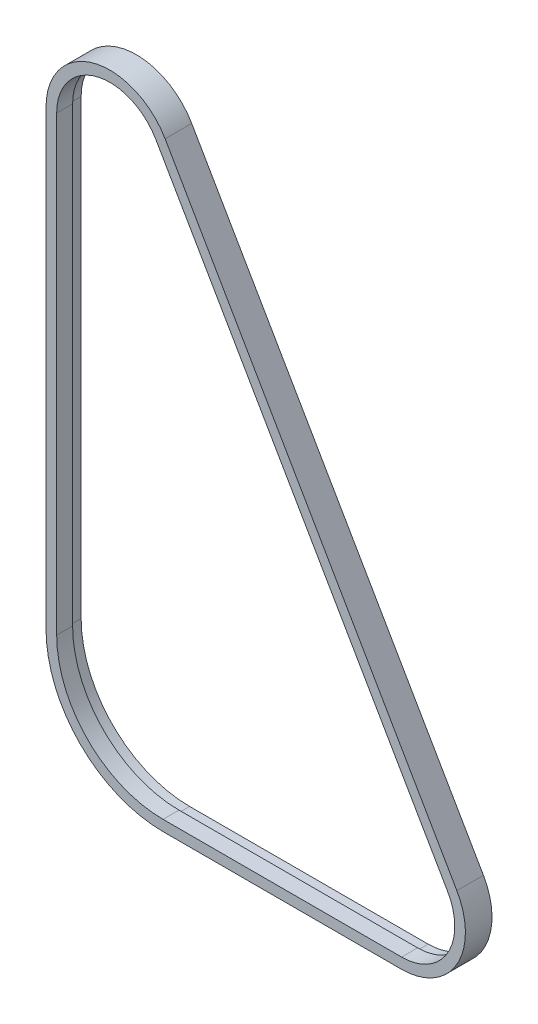
ISO-10303-21;
HEADER;
FILE_DESCRIPTION(('STEP AP214'),'2;1');
FILE_NAME('part.step','',(''),(''),'','','');
FILE_SCHEMA(('AUTOMOTIVE_DESIGN { 1 0 10303 214 1 1 1 1 }'));
ENDSEC;
DATA;
#1=APPLICATION_CONTEXT('core data for automotive mechanical design processes');
#2=APPLICATION_PROTOCOL_DEFINITION('international standard','automotive_design',2000,#1);
#3=PRODUCT_CONTEXT('',#1,'mechanical');
#4=PRODUCT('Part','Part','',(#3));
#5=PRODUCT_RELATED_PRODUCT_CATEGORY('part','',(#4));
#6=PRODUCT_DEFINITION_FORMATION('','',#4);
#7=PRODUCT_DEFINITION_CONTEXT('part definition',#1,'design');
#8=PRODUCT_DEFINITION('design','',#6,#7);
#9=PRODUCT_DEFINITION_SHAPE('','',#8);
#10=(LENGTH_UNIT() NAMED_UNIT(*) SI_UNIT(.MILLI.,.METRE.));
#11=(NAMED_UNIT(*) PLANE_ANGLE_UNIT() SI_UNIT($,.RADIAN.));
#12=(NAMED_UNIT(*) SI_UNIT($,.STERADIAN.) SOLID_ANGLE_UNIT());
#13=UNCERTAINTY_MEASURE_WITH_UNIT(LENGTH_MEASURE(1.E-05),#10,'distance_accuracy_value','');
#14=(GEOMETRIC_REPRESENTATION_CONTEXT(3) GLOBAL_UNCERTAINTY_ASSIGNED_CONTEXT((#13)) GLOBAL_UNIT_ASSIGNED_CONTEXT((#10,
#11,#12)) REPRESENTATION_CONTEXT('',''));
#15=CARTESIAN_POINT('',(0.,0.,0.));
#16=DIRECTION('',(0.,0.,1.));
#17=DIRECTION('',(1.,0.,0.));
#18=AXIS2_PLACEMENT_3D('',#15,#16,#17);
#19=CARTESIAN_POINT('',(-50.,525.,0.));
#20=DIRECTION('',(0.,0.,-1.));
#21=DIRECTION('',(-1.,0.,0.));
#22=AXIS2_PLACEMENT_3D('',#19,#20,#21);
#23=PLANE('',#22);
#24=CARTESIAN_POINT('',(-50.,525.,0.));
#25=DIRECTION('',(0.,0.,1.));
#26=DIRECTION('',(-1.,0.,0.));
#27=AXIS2_PLACEMENT_3D('',#24,#25,#26);
#28=CIRCLE('',#27,60.);
#29=CARTESIAN_POINT('',(1.96152422706617,555.,0.));
#30=VERTEX_POINT('',#29);
#31=CARTESIAN_POINT('',(-110.,525.,0.));
#32=VERTEX_POINT('',#31);
#33=EDGE_CURVE('E229',#30,#32,#28,.T.);
#34=ORIENTED_EDGE('',*,*,#33,.F.);
#35=DIRECTION('',(-0.500000000000004,0.866025403784436,0.));
#36=VECTOR('',#35,1.);
#37=CARTESIAN_POINT('',(1.96152422706617,555.,0.));
#38=LINE('',#37,#36);
#39=CARTESIAN_POINT('',(276.202902092142,80.0000000000001,0.));
#40=VERTEX_POINT('',#39);
#41=EDGE_CURVE('E234',#40,#30,#38,.T.);
#42=ORIENTED_EDGE('',*,*,#41,.F.);
#43=CARTESIAN_POINT('',(224.241377865075,49.9999999999999,0.));
#44=DIRECTION('',(0.,0.,1.));
#45=DIRECTION('',(-1.,0.,0.));
#46=AXIS2_PLACEMENT_3D('',#43,#44,#45);
#47=CIRCLE('',#46,60.);
#48=CARTESIAN_POINT('',(224.241377865075,-10.0000000000001,0.));
#49=VERTEX_POINT('',#48);
#50=EDGE_CURVE('E253',#49,#40,#47,.T.);
#51=ORIENTED_EDGE('',*,*,#50,.F.);
#52=DIRECTION('',(1.,0.,0.));
#53=VECTOR('',#52,1.);
#54=CARTESIAN_POINT('',(224.241377865075,-10.0000000000001,0.));
#55=LINE('',#54,#53);
#56=CARTESIAN_POINT('',(0.,-10.,0.));
#57=VERTEX_POINT('',#56);
#58=EDGE_CURVE('E251',#57,#49,#55,.T.);
#59=ORIENTED_EDGE('',*,*,#58,.F.);
#60=CARTESIAN_POINT('',(0.,100.,0.));
#61=DIRECTION('',(0.,0.,1.));
#62=DIRECTION('',(1.,0.,0.));
#63=AXIS2_PLACEMENT_3D('',#60,#61,#62);
#64=CIRCLE('',#63,110.);
#65=CARTESIAN_POINT('',(-110.,100.,0.));
#66=VERTEX_POINT('',#65);
#67=EDGE_CURVE('E249',#66,#57,#64,.T.);
#68=ORIENTED_EDGE('',*,*,#67,.F.);
#69=DIRECTION('',(0.,-1.,0.));
#70=VECTOR('',#69,1.);
#71=CARTESIAN_POINT('',(-110.,100.,0.));
#72=LINE('',#71,#70);
#73=EDGE_CURVE('E247',#32,#66,#72,.T.);
#74=ORIENTED_EDGE('',*,*,#73,.F.);
#75=EDGE_LOOP('',(#34,#42,#51,#59,#68,#74));
#76=FACE_BOUND('',#75,.T.);
#77=DIRECTION('',(-0.500000000000004,0.866025403784436,0.));
#78=VECTOR('',#77,1.);
#79=CARTESIAN_POINT('',(269.274698861866,76.0000000000001,0.));
#80=LINE('',#79,#78);
#81=CARTESIAN_POINT('',(269.274698861866,76.0000000000001,0.));
#82=VERTEX_POINT('',#81);
#83=CARTESIAN_POINT('',(-4.96667900320927,551.,0.));
#84=VERTEX_POINT('',#83);
#85=EDGE_CURVE('E178',#82,#84,#80,.T.);
#86=ORIENTED_EDGE('',*,*,#85,.T.);
#87=CARTESIAN_POINT('',(-50.,525.,0.));
#88=DIRECTION('',(0.,0.,1.));
#89=DIRECTION('',(1.,0.,0.));
#90=AXIS2_PLACEMENT_3D('',#87,#88,#89);
#91=CIRCLE('',#90,52.);
#92=CARTESIAN_POINT('',(-102.,525.,0.));
#93=VERTEX_POINT('',#92);
#94=EDGE_CURVE('E53',#84,#93,#91,.T.);
#95=ORIENTED_EDGE('',*,*,#94,.T.);
#96=DIRECTION('',(0.,-1.,0.));
#97=VECTOR('',#96,1.);
#98=CARTESIAN_POINT('',(-102.,525.,0.));
#99=LINE('',#98,#97);
#100=CARTESIAN_POINT('',(-102.,100.,0.));
#101=VERTEX_POINT('',#100);
#102=EDGE_CURVE('E182',#93,#101,#99,.T.);
#103=ORIENTED_EDGE('',*,*,#102,.T.);
#104=CARTESIAN_POINT('',(0.,100.,0.));
#105=DIRECTION('',(0.,0.,1.));
#106=DIRECTION('',(1.,0.,0.));
#107=AXIS2_PLACEMENT_3D('',#104,#105,#106);
#108=CIRCLE('',#107,102.);
#109=CARTESIAN_POINT('',(0.,-2.00000000000003,0.));
#110=VERTEX_POINT('',#109);
#111=EDGE_CURVE('E519',#101,#110,#108,.T.);
#112=ORIENTED_EDGE('',*,*,#111,.T.);
#113=DIRECTION('',(1.,0.,0.));
#114=VECTOR('',#113,1.);
#115=CARTESIAN_POINT('',(0.,-2.00000000000003,0.));
#116=LINE('',#115,#114);
#117=CARTESIAN_POINT('',(224.241377865075,-2.00000000000007,0.));
#118=VERTEX_POINT('',#117);
#119=EDGE_CURVE('E516',#110,#118,#116,.T.);
#120=ORIENTED_EDGE('',*,*,#119,.T.);
#121=CARTESIAN_POINT('',(224.241377865075,49.9999999999999,0.));
#122=DIRECTION('',(0.,0.,1.));
#123=DIRECTION('',(1.,0.,0.));
#124=AXIS2_PLACEMENT_3D('',#121,#122,#123);
#125=CIRCLE('',#124,52.);
#126=EDGE_CURVE('E510',#118,#82,#125,.T.);
#127=ORIENTED_EDGE('',*,*,#126,.T.);
#128=EDGE_LOOP('',(#86,#95,#103,#112,#120,#127));
#129=FACE_BOUND('',#128,.T.);
#130=ADVANCED_FACE('F38',(#76,#129),#23,.T.);
#131=CARTESIAN_POINT('',(-50.,525.,25.));
#132=DIRECTION('',(0.,0.,-1.));
#133=DIRECTION('',(-1.,0.,0.));
#134=AXIS2_PLACEMENT_3D('',#131,#132,#133);
#135=PLANE('',#134);
#136=CARTESIAN_POINT('',(-50.,525.,25.));
#137=DIRECTION('',(0.,0.,1.));
#138=DIRECTION('',(-1.,0.,0.));
#139=AXIS2_PLACEMENT_3D('',#136,#137,#138);
#140=CIRCLE('',#139,60.);
#141=CARTESIAN_POINT('',(1.96152422706617,555.,25.));
#142=VERTEX_POINT('',#141);
#143=CARTESIAN_POINT('',(-110.,525.,25.));
#144=VERTEX_POINT('',#143);
#145=EDGE_CURVE('E230',#142,#144,#140,.T.);
#146=ORIENTED_EDGE('',*,*,#145,.T.);
#147=DIRECTION('',(0.,-1.,0.));
#148=VECTOR('',#147,1.);
#149=CARTESIAN_POINT('',(-110.,100.,25.));
#150=LINE('',#149,#148);
#151=CARTESIAN_POINT('',(-110.,100.,25.));
#152=VERTEX_POINT('',#151);
#153=EDGE_CURVE('E233',#144,#152,#150,.T.);
#154=ORIENTED_EDGE('',*,*,#153,.T.);
#155=CARTESIAN_POINT('',(0.,100.,25.));
#156=DIRECTION('',(0.,0.,1.));
#157=DIRECTION('',(1.,0.,0.));
#158=AXIS2_PLACEMENT_3D('',#155,#156,#157);
#159=CIRCLE('',#158,110.);
#160=CARTESIAN_POINT('',(0.,-10.,25.));
#161=VERTEX_POINT('',#160);
#162=EDGE_CURVE('E236',#152,#161,#159,.T.);
#163=ORIENTED_EDGE('',*,*,#162,.T.);
#164=DIRECTION('',(1.,0.,0.));
#165=VECTOR('',#164,1.);
#166=CARTESIAN_POINT('',(224.241377865075,-10.0000000000001,25.));
#167=LINE('',#166,#165);
#168=CARTESIAN_POINT('',(224.241377865075,-10.0000000000001,25.));
#169=VERTEX_POINT('',#168);
#170=EDGE_CURVE('E238',#161,#169,#167,.T.);
#171=ORIENTED_EDGE('',*,*,#170,.T.);
#172=CARTESIAN_POINT('',(224.241377865075,49.9999999999999,25.));
#173=DIRECTION('',(0.,0.,1.));
#174=DIRECTION('',(-1.,0.,0.));
#175=AXIS2_PLACEMENT_3D('',#172,#173,#174);
#176=CIRCLE('',#175,60.);
#177=CARTESIAN_POINT('',(276.202902092142,80.0000000000001,25.));
#178=VERTEX_POINT('',#177);
#179=EDGE_CURVE('E240',#169,#178,#176,.T.);
#180=ORIENTED_EDGE('',*,*,#179,.T.);
#181=DIRECTION('',(-0.500000000000004,0.866025403784436,0.));
#182=VECTOR('',#181,1.);
#183=CARTESIAN_POINT('',(1.96152422706617,555.,25.));
#184=LINE('',#183,#182);
#185=EDGE_CURVE('E242',#178,#142,#184,.T.);
#186=ORIENTED_EDGE('',*,*,#185,.T.);
#187=EDGE_LOOP('',(#146,#154,#163,#171,#180,#186));
#188=FACE_BOUND('',#187,.T.);
#189=CARTESIAN_POINT('',(0.,100.,25.));
#190=DIRECTION('',(0.,0.,1.));
#191=DIRECTION('',(1.,0.,0.));
#192=AXIS2_PLACEMENT_3D('',#189,#190,#191);
#193=CIRCLE('',#192,100.);
#194=CARTESIAN_POINT('',(-100.,100.,25.));
#195=VERTEX_POINT('',#194);
#196=CARTESIAN_POINT('',(0.,0.,25.));
#197=VERTEX_POINT('',#196);
#198=EDGE_CURVE('E198',#195,#197,#193,.T.);
#199=ORIENTED_EDGE('',*,*,#198,.F.);
#200=DIRECTION('',(0.,-1.,0.));
#201=VECTOR('',#200,1.);
#202=CARTESIAN_POINT('',(-100.,100.,25.));
#203=LINE('',#202,#201);
#204=CARTESIAN_POINT('',(-100.,525.,25.));
#205=VERTEX_POINT('',#204);
#206=EDGE_CURVE('E209',#205,#195,#203,.T.);
#207=ORIENTED_EDGE('',*,*,#206,.F.);
#208=CARTESIAN_POINT('',(-50.,525.,25.));
#209=DIRECTION('',(0.,0.,1.));
#210=DIRECTION('',(-1.,0.,0.));
#211=AXIS2_PLACEMENT_3D('',#208,#209,#210);
#212=CIRCLE('',#211,50.);
#213=CARTESIAN_POINT('',(-6.69872981077816,550.,25.));
#214=VERTEX_POINT('',#213);
#215=EDGE_CURVE('E206',#214,#205,#212,.T.);
#216=ORIENTED_EDGE('',*,*,#215,.F.);
#217=DIRECTION('',(-0.500000000000004,0.866025403784436,0.));
#218=VECTOR('',#217,1.);
#219=CARTESIAN_POINT('',(-6.69872981077817,550.,25.));
#220=LINE('',#219,#218);
#221=CARTESIAN_POINT('',(267.542648054297,75.0000000000002,25.));
#222=VERTEX_POINT('',#221);
#223=EDGE_CURVE('E204',#222,#214,#220,.T.);
#224=ORIENTED_EDGE('',*,*,#223,.F.);
#225=CARTESIAN_POINT('',(224.241377865075,49.9999999999999,25.));
#226=DIRECTION('',(0.,0.,1.));
#227=DIRECTION('',(-1.,0.,0.));
#228=AXIS2_PLACEMENT_3D('',#225,#226,#227);
#229=CIRCLE('',#228,50.);
#230=CARTESIAN_POINT('',(224.241377865075,0.,25.));
#231=VERTEX_POINT('',#230);
#232=EDGE_CURVE('E202',#231,#222,#229,.T.);
#233=ORIENTED_EDGE('',*,*,#232,.F.);
#234=DIRECTION('',(1.,0.,0.));
#235=VECTOR('',#234,1.);
#236=CARTESIAN_POINT('',(224.241377865075,0.,25.));
#237=LINE('',#236,#235);
#238=EDGE_CURVE('E200',#197,#231,#237,.T.);
#239=ORIENTED_EDGE('',*,*,#238,.F.);
#240=EDGE_LOOP('',(#199,#207,#216,#224,#233,#239));
#241=FACE_BOUND('',#240,.T.);
#242=ADVANCED_FACE('F294',(#188,#241),#135,.F.);
#243=CARTESIAN_POINT('',(-50.,525.,25.));
#244=DIRECTION('',(0.,0.,-1.));
#245=DIRECTION('',(-1.,0.,0.));
#246=AXIS2_PLACEMENT_3D('',#243,#244,#245);
#247=CYLINDRICAL_SURFACE('',#246,60.);
#248=ORIENTED_EDGE('',*,*,#33,.T.);
#249=DIRECTION('',(0.,0.,-1.));
#250=VECTOR('',#249,1.);
#251=CARTESIAN_POINT('',(-110.,525.,25.));
#252=LINE('',#251,#250);
#253=EDGE_CURVE('E46',#144,#32,#252,.T.);
#254=ORIENTED_EDGE('',*,*,#253,.F.);
#255=ORIENTED_EDGE('',*,*,#145,.F.);
#256=DIRECTION('',(0.,0.,-1.));
#257=VECTOR('',#256,1.);
#258=CARTESIAN_POINT('',(1.96152422706617,555.,25.));
#259=LINE('',#258,#257);
#260=EDGE_CURVE('E244',#142,#30,#259,.T.);
#261=ORIENTED_EDGE('',*,*,#260,.T.);
#262=EDGE_LOOP('',(#248,#254,#255,#261));
#263=FACE_BOUND('',#262,.T.);
#264=ADVANCED_FACE('F40',(#263),#247,.T.);
#265=CARTESIAN_POINT('',(-110.,100.,25.));
#266=DIRECTION('',(1.,0.,0.));
#267=DIRECTION('',(0.,1.,0.));
#268=AXIS2_PLACEMENT_3D('',#265,#266,#267);
#269=PLANE('',#268);
#270=ORIENTED_EDGE('',*,*,#73,.T.);
#271=DIRECTION('',(0.,0.,-1.));
#272=VECTOR('',#271,1.);
#273=CARTESIAN_POINT('',(-110.,100.,25.));
#274=LINE('',#273,#272);
#275=EDGE_CURVE('E267',#152,#66,#274,.T.);
#276=ORIENTED_EDGE('',*,*,#275,.F.);
#277=ORIENTED_EDGE('',*,*,#153,.F.);
#278=ORIENTED_EDGE('',*,*,#253,.T.);
#279=EDGE_LOOP('',(#270,#276,#277,#278));
#280=FACE_BOUND('',#279,.T.);
#281=ADVANCED_FACE('F272',(#280),#269,.F.);
#282=CARTESIAN_POINT('',(0.,100.,25.));
#283=DIRECTION('',(0.,0.,-1.));
#284=DIRECTION('',(-1.,0.,0.));
#285=AXIS2_PLACEMENT_3D('',#282,#283,#284);
#286=CYLINDRICAL_SURFACE('',#285,110.);
#287=ORIENTED_EDGE('',*,*,#67,.T.);
#288=DIRECTION('',(0.,0.,-1.));
#289=VECTOR('',#288,1.);
#290=CARTESIAN_POINT('',(0.,-10.,25.));
#291=LINE('',#290,#289);
#292=EDGE_CURVE('E264',#161,#57,#291,.T.);
#293=ORIENTED_EDGE('',*,*,#292,.F.);
#294=ORIENTED_EDGE('',*,*,#162,.F.);
#295=ORIENTED_EDGE('',*,*,#275,.T.);
#296=EDGE_LOOP('',(#287,#293,#294,#295));
#297=FACE_BOUND('',#296,.T.);
#298=ADVANCED_FACE('F286',(#297),#286,.T.);
#299=CARTESIAN_POINT('',(224.241377865075,-10.0000000000001,25.));
#300=DIRECTION('',(0.,1.,0.));
#301=DIRECTION('',(-1.,0.,0.));
#302=AXIS2_PLACEMENT_3D('',#299,#300,#301);
#303=PLANE('',#302);
#304=ORIENTED_EDGE('',*,*,#58,.T.);
#305=DIRECTION('',(0.,0.,-1.));
#306=VECTOR('',#305,1.);
#307=CARTESIAN_POINT('',(224.241377865075,-10.0000000000001,25.));
#308=LINE('',#307,#306);
#309=EDGE_CURVE('E261',#169,#49,#308,.T.);
#310=ORIENTED_EDGE('',*,*,#309,.F.);
#311=ORIENTED_EDGE('',*,*,#170,.F.);
#312=ORIENTED_EDGE('',*,*,#292,.T.);
#313=EDGE_LOOP('',(#304,#310,#311,#312));
#314=FACE_BOUND('',#313,.T.);
#315=ADVANCED_FACE('F290',(#314),#303,.F.);
#316=CARTESIAN_POINT('',(224.241377865075,49.9999999999999,25.));
#317=DIRECTION('',(0.,0.,-1.));
#318=DIRECTION('',(-1.,0.,0.));
#319=AXIS2_PLACEMENT_3D('',#316,#317,#318);
#320=CYLINDRICAL_SURFACE('',#319,60.);
#321=ORIENTED_EDGE('',*,*,#50,.T.);
#322=DIRECTION('',(0.,0.,-1.));
#323=VECTOR('',#322,1.);
#324=CARTESIAN_POINT('',(276.202902092142,80.0000000000001,25.));
#325=LINE('',#324,#323);
#326=EDGE_CURVE('E258',#178,#40,#325,.T.);
#327=ORIENTED_EDGE('',*,*,#326,.F.);
#328=ORIENTED_EDGE('',*,*,#179,.F.);
#329=ORIENTED_EDGE('',*,*,#309,.T.);
#330=EDGE_LOOP('',(#321,#327,#328,#329));
#331=FACE_BOUND('',#330,.T.);
#332=ADVANCED_FACE('F301',(#331),#320,.T.);
#333=CARTESIAN_POINT('',(1.96152422706617,555.,25.));
#334=DIRECTION('',(-0.866025403784436,-0.500000000000004,0.));
#335=DIRECTION('',(0.500000000000004,-0.866025403784436,0.));
#336=AXIS2_PLACEMENT_3D('',#333,#334,#335);
#337=PLANE('',#336);
#338=ORIENTED_EDGE('',*,*,#41,.T.);
#339=ORIENTED_EDGE('',*,*,#260,.F.);
#340=ORIENTED_EDGE('',*,*,#185,.F.);
#341=ORIENTED_EDGE('',*,*,#326,.T.);
#342=EDGE_LOOP('',(#338,#339,#340,#341));
#343=FACE_BOUND('',#342,.T.);
#344=ADVANCED_FACE('F299',(#343),#337,.F.);
#345=CARTESIAN_POINT('',(0.,100.,25.));
#346=DIRECTION('',(0.,0.,-1.));
#347=DIRECTION('',(-1.,0.,0.));
#348=AXIS2_PLACEMENT_3D('',#345,#346,#347);
#349=CYLINDRICAL_SURFACE('',#348,100.);
#350=CARTESIAN_POINT('',(0.,100.,10.));
#351=DIRECTION('',(0.,0.,1.));
#352=DIRECTION('',(1.,0.,0.));
#353=AXIS2_PLACEMENT_3D('',#350,#351,#352);
#354=CIRCLE('',#353,100.);
#355=CARTESIAN_POINT('',(-100.,100.,10.));
#356=VERTEX_POINT('',#355);
#357=CARTESIAN_POINT('',(0.,0.,10.));
#358=VERTEX_POINT('',#357);
#359=EDGE_CURVE('E196',#356,#358,#354,.T.);
#360=ORIENTED_EDGE('',*,*,#359,.F.);
#361=DIRECTION('',(0.,0.,-1.));
#362=VECTOR('',#361,1.);
#363=CARTESIAN_POINT('',(-100.,100.,25.));
#364=LINE('',#363,#362);
#365=EDGE_CURVE('E211',#195,#356,#364,.T.);
#366=ORIENTED_EDGE('',*,*,#365,.F.);
#367=ORIENTED_EDGE('',*,*,#198,.T.);
#368=DIRECTION('',(0.,0.,-1.));
#369=VECTOR('',#368,1.);
#370=CARTESIAN_POINT('',(0.,0.,25.));
#371=LINE('',#370,#369);
#372=EDGE_CURVE('E226',#197,#358,#371,.T.);
#373=ORIENTED_EDGE('',*,*,#372,.T.);
#374=EDGE_LOOP('',(#360,#366,#367,#373));
#375=FACE_BOUND('',#374,.T.);
#376=ADVANCED_FACE('F308',(#375),#349,.F.);
#377=CARTESIAN_POINT('',(224.241377865075,0.,25.));
#378=DIRECTION('',(0.,1.,0.));
#379=DIRECTION('',(0.,0.,1.));
#380=AXIS2_PLACEMENT_3D('',#377,#378,#379);
#381=PLANE('',#380);
#382=DIRECTION('',(1.,0.,0.));
#383=VECTOR('',#382,1.);
#384=CARTESIAN_POINT('',(224.241377865075,0.,10.));
#385=LINE('',#384,#383);
#386=CARTESIAN_POINT('',(224.241377865075,0.,10.));
#387=VERTEX_POINT('',#386);
#388=EDGE_CURVE('E194',#358,#387,#385,.T.);
#389=ORIENTED_EDGE('',*,*,#388,.F.);
#390=ORIENTED_EDGE('',*,*,#372,.F.);
#391=ORIENTED_EDGE('',*,*,#238,.T.);
#392=DIRECTION('',(0.,0.,-1.));
#393=VECTOR('',#392,1.);
#394=CARTESIAN_POINT('',(224.241377865075,0.,25.));
#395=LINE('',#394,#393);
#396=EDGE_CURVE('E223',#231,#387,#395,.T.);
#397=ORIENTED_EDGE('',*,*,#396,.T.);
#398=EDGE_LOOP('',(#389,#390,#391,#397));
#399=FACE_BOUND('',#398,.T.);
#400=ADVANCED_FACE('F320',(#399),#381,.T.);
#401=CARTESIAN_POINT('',(224.241377865075,49.9999999999999,25.));
#402=DIRECTION('',(0.,0.,-1.));
#403=DIRECTION('',(-1.,0.,0.));
#404=AXIS2_PLACEMENT_3D('',#401,#402,#403);
#405=CYLINDRICAL_SURFACE('',#404,50.);
#406=CARTESIAN_POINT('',(224.241377865075,49.9999999999999,10.));
#407=DIRECTION('',(0.,0.,1.));
#408=DIRECTION('',(1.,0.,0.));
#409=AXIS2_PLACEMENT_3D('',#406,#407,#408);
#410=CIRCLE('',#409,50.);
#411=CARTESIAN_POINT('',(267.542648054297,75.0000000000002,10.));
#412=VERTEX_POINT('',#411);
#413=EDGE_CURVE('E192',#387,#412,#410,.T.);
#414=ORIENTED_EDGE('',*,*,#413,.F.);
#415=ORIENTED_EDGE('',*,*,#396,.F.);
#416=ORIENTED_EDGE('',*,*,#232,.T.);
#417=DIRECTION('',(0.,0.,-1.));
#418=VECTOR('',#417,1.);
#419=CARTESIAN_POINT('',(267.542648054297,75.0000000000002,25.));
#420=LINE('',#419,#418);
#421=EDGE_CURVE('E220',#222,#412,#420,.T.);
#422=ORIENTED_EDGE('',*,*,#421,.T.);
#423=EDGE_LOOP('',(#414,#415,#416,#422));
#424=FACE_BOUND('',#423,.T.);
#425=ADVANCED_FACE('F324',(#424),#405,.F.);
#426=CARTESIAN_POINT('',(-6.69872981077817,550.,25.));
#427=DIRECTION('',(-0.866025403784436,-0.500000000000004,0.));
#428=DIRECTION('',(0.500000000000004,-0.866025403784436,0.));
#429=AXIS2_PLACEMENT_3D('',#426,#427,#428);
#430=PLANE('',#429);
#431=DIRECTION('',(-0.500000000000004,0.866025403784436,0.));
#432=VECTOR('',#431,1.);
#433=CARTESIAN_POINT('',(-6.69872981077817,550.,10.));
#434=LINE('',#433,#432);
#435=CARTESIAN_POINT('',(-6.69872981077816,550.,10.));
#436=VERTEX_POINT('',#435);
#437=EDGE_CURVE('E185',#412,#436,#434,.T.);
#438=ORIENTED_EDGE('',*,*,#437,.F.);
#439=ORIENTED_EDGE('',*,*,#421,.F.);
#440=ORIENTED_EDGE('',*,*,#223,.T.);
#441=DIRECTION('',(0.,0.,-1.));
#442=VECTOR('',#441,1.);
#443=CARTESIAN_POINT('',(-6.69872981077816,550.,25.));
#444=LINE('',#443,#442);
#445=EDGE_CURVE('E217',#214,#436,#444,.T.);
#446=ORIENTED_EDGE('',*,*,#445,.T.);
#447=EDGE_LOOP('',(#438,#439,#440,#446));
#448=FACE_BOUND('',#447,.T.);
#449=ADVANCED_FACE('F328',(#448),#430,.T.);
#450=CARTESIAN_POINT('',(-50.,525.,25.));
#451=DIRECTION('',(0.,0.,-1.));
#452=DIRECTION('',(-1.,0.,0.));
#453=AXIS2_PLACEMENT_3D('',#450,#451,#452);
#454=CYLINDRICAL_SURFACE('',#453,50.);
#455=CARTESIAN_POINT('',(-50.,525.,10.));
#456=DIRECTION('',(0.,0.,1.));
#457=DIRECTION('',(1.,0.,0.));
#458=AXIS2_PLACEMENT_3D('',#455,#456,#457);
#459=CIRCLE('',#458,50.);
#460=CARTESIAN_POINT('',(-100.,525.,10.));
#461=VERTEX_POINT('',#460);
#462=EDGE_CURVE('E60',#436,#461,#459,.T.);
#463=ORIENTED_EDGE('',*,*,#462,.F.);
#464=ORIENTED_EDGE('',*,*,#445,.F.);
#465=ORIENTED_EDGE('',*,*,#215,.T.);
#466=DIRECTION('',(0.,0.,-1.));
#467=VECTOR('',#466,1.);
#468=CARTESIAN_POINT('',(-100.,525.,25.));
#469=LINE('',#468,#467);
#470=EDGE_CURVE('E214',#205,#461,#469,.T.);
#471=ORIENTED_EDGE('',*,*,#470,.T.);
#472=EDGE_LOOP('',(#463,#464,#465,#471));
#473=FACE_BOUND('',#472,.T.);
#474=ADVANCED_FACE('F332',(#473),#454,.F.);
#475=CARTESIAN_POINT('',(-100.,100.,25.));
#476=DIRECTION('',(1.,0.,0.));
#477=DIRECTION('',(0.,0.,-1.));
#478=AXIS2_PLACEMENT_3D('',#475,#476,#477);
#479=PLANE('',#478);
#480=DIRECTION('',(0.,-1.,0.));
#481=VECTOR('',#480,1.);
#482=CARTESIAN_POINT('',(-100.,100.,10.));
#483=LINE('',#482,#481);
#484=EDGE_CURVE('E11',#461,#356,#483,.T.);
#485=ORIENTED_EDGE('',*,*,#484,.F.);
#486=ORIENTED_EDGE('',*,*,#470,.F.);
#487=ORIENTED_EDGE('',*,*,#206,.T.);
#488=ORIENTED_EDGE('',*,*,#365,.T.);
#489=EDGE_LOOP('',(#485,#486,#487,#488));
#490=FACE_BOUND('',#489,.T.);
#491=ADVANCED_FACE('F336',(#490),#479,.T.);
#492=CARTESIAN_POINT('',(-50.,525.,10.));
#493=DIRECTION('',(0.,0.,-1.));
#494=DIRECTION('',(-1.,0.,0.));
#495=AXIS2_PLACEMENT_3D('',#492,#493,#494);
#496=CYLINDRICAL_SURFACE('',#495,52.);
#497=ORIENTED_EDGE('',*,*,#94,.F.);
#498=DIRECTION('',(0.,0.,-1.));
#499=VECTOR('',#498,1.);
#500=CARTESIAN_POINT('',(-4.96667900320928,551.,10.));
#501=LINE('',#500,#499);
#502=CARTESIAN_POINT('',(-4.96667900320928,551.,10.));
#503=VERTEX_POINT('',#502);
#504=EDGE_CURVE('E177',#503,#84,#501,.T.);
#505=ORIENTED_EDGE('',*,*,#504,.F.);
#506=CARTESIAN_POINT('',(-50.,525.,10.));
#507=DIRECTION('',(0.,0.,1.));
#508=DIRECTION('',(1.,0.,0.));
#509=AXIS2_PLACEMENT_3D('',#506,#507,#508);
#510=CIRCLE('',#509,52.);
#511=CARTESIAN_POINT('',(-102.,525.,10.));
#512=VERTEX_POINT('',#511);
#513=EDGE_CURVE('E168',#503,#512,#510,.T.);
#514=ORIENTED_EDGE('',*,*,#513,.T.);
#515=DIRECTION('',(0.,0.,-1.));
#516=VECTOR('',#515,1.);
#517=CARTESIAN_POINT('',(-102.,525.,10.));
#518=LINE('',#517,#516);
#519=EDGE_CURVE('E176',#512,#93,#518,.T.);
#520=ORIENTED_EDGE('',*,*,#519,.T.);
#521=EDGE_LOOP('',(#497,#505,#514,#520));
#522=FACE_BOUND('',#521,.T.);
#523=ADVANCED_FACE('F175',(#522),#496,.F.);
#524=CARTESIAN_POINT('',(-102.,525.,10.));
#525=DIRECTION('',(1.,0.,0.));
#526=DIRECTION('',(0.,0.,-1.));
#527=AXIS2_PLACEMENT_3D('',#524,#525,#526);
#528=PLANE('',#527);
#529=ORIENTED_EDGE('',*,*,#102,.F.);
#530=ORIENTED_EDGE('',*,*,#519,.F.);
#531=DIRECTION('',(0.,-1.,0.));
#532=VECTOR('',#531,1.);
#533=CARTESIAN_POINT('',(-102.,525.,10.));
#534=LINE('',#533,#532);
#535=CARTESIAN_POINT('',(-102.,100.,10.));
#536=VERTEX_POINT('',#535);
#537=EDGE_CURVE('E164',#512,#536,#534,.T.);
#538=ORIENTED_EDGE('',*,*,#537,.T.);
#539=DIRECTION('',(0.,0.,-1.));
#540=VECTOR('',#539,1.);
#541=CARTESIAN_POINT('',(-102.,100.,10.));
#542=LINE('',#541,#540);
#543=EDGE_CURVE('E183',#536,#101,#542,.T.);
#544=ORIENTED_EDGE('',*,*,#543,.T.);
#545=EDGE_LOOP('',(#529,#530,#538,#544));
#546=FACE_BOUND('',#545,.T.);
#547=ADVANCED_FACE('F180',(#546),#528,.T.);
#548=CARTESIAN_POINT('',(0.,100.,10.));
#549=DIRECTION('',(0.,0.,-1.));
#550=DIRECTION('',(-1.,0.,0.));
#551=AXIS2_PLACEMENT_3D('',#548,#549,#550);
#552=CYLINDRICAL_SURFACE('',#551,102.);
#553=ORIENTED_EDGE('',*,*,#111,.F.);
#554=ORIENTED_EDGE('',*,*,#543,.F.);
#555=CARTESIAN_POINT('',(0.,100.,10.));
#556=DIRECTION('',(0.,0.,1.));
#557=DIRECTION('',(1.,0.,0.));
#558=AXIS2_PLACEMENT_3D('',#555,#556,#557);
#559=CIRCLE('',#558,102.);
#560=CARTESIAN_POINT('',(0.,-2.00000000000003,10.));
#561=VERTEX_POINT('',#560);
#562=EDGE_CURVE('E170',#536,#561,#559,.T.);
#563=ORIENTED_EDGE('',*,*,#562,.T.);
#564=DIRECTION('',(0.,0.,-1.));
#565=VECTOR('',#564,1.);
#566=CARTESIAN_POINT('',(0.,-2.00000000000003,10.));
#567=LINE('',#566,#565);
#568=EDGE_CURVE('E187',#561,#110,#567,.T.);
#569=ORIENTED_EDGE('',*,*,#568,.T.);
#570=EDGE_LOOP('',(#553,#554,#563,#569));
#571=FACE_BOUND('',#570,.T.);
#572=ADVANCED_FACE('F345',(#571),#552,.F.);
#573=CARTESIAN_POINT('',(0.,-2.00000000000003,10.));
#574=DIRECTION('',(0.,1.,0.));
#575=DIRECTION('',(-1.,0.,0.));
#576=AXIS2_PLACEMENT_3D('',#573,#574,#575);
#577=PLANE('',#576);
#578=ORIENTED_EDGE('',*,*,#119,.F.);
#579=ORIENTED_EDGE('',*,*,#568,.F.);
#580=DIRECTION('',(1.,0.,0.));
#581=VECTOR('',#580,1.);
#582=CARTESIAN_POINT('',(0.,-2.00000000000003,10.));
#583=LINE('',#582,#581);
#584=CARTESIAN_POINT('',(224.241377865075,-2.00000000000007,10.));
#585=VERTEX_POINT('',#584);
#586=EDGE_CURVE('E535',#561,#585,#583,.T.);
#587=ORIENTED_EDGE('',*,*,#586,.T.);
#588=DIRECTION('',(0.,0.,-1.));
#589=VECTOR('',#588,1.);
#590=CARTESIAN_POINT('',(224.241377865075,-2.00000000000007,10.));
#591=LINE('',#590,#589);
#592=EDGE_CURVE('E526',#585,#118,#591,.T.);
#593=ORIENTED_EDGE('',*,*,#592,.T.);
#594=EDGE_LOOP('',(#578,#579,#587,#593));
#595=FACE_BOUND('',#594,.T.);
#596=ADVANCED_FACE('F348',(#595),#577,.T.);
#597=CARTESIAN_POINT('',(224.241377865075,49.9999999999999,10.));
#598=DIRECTION('',(0.,0.,-1.));
#599=DIRECTION('',(-1.,0.,0.));
#600=AXIS2_PLACEMENT_3D('',#597,#598,#599);
#601=CYLINDRICAL_SURFACE('',#600,52.);
#602=ORIENTED_EDGE('',*,*,#126,.F.);
#603=ORIENTED_EDGE('',*,*,#592,.F.);
#604=CARTESIAN_POINT('',(224.241377865075,49.9999999999999,10.));
#605=DIRECTION('',(0.,0.,1.));
#606=DIRECTION('',(1.,0.,0.));
#607=AXIS2_PLACEMENT_3D('',#604,#605,#606);
#608=CIRCLE('',#607,52.);
#609=CARTESIAN_POINT('',(269.274698861866,76.0000000000001,10.));
#610=VERTEX_POINT('',#609);
#611=EDGE_CURVE('E533',#585,#610,#608,.T.);
#612=ORIENTED_EDGE('',*,*,#611,.T.);
#613=DIRECTION('',(0.,0.,-1.));
#614=VECTOR('',#613,1.);
#615=CARTESIAN_POINT('',(269.274698861866,76.0000000000001,10.));
#616=LINE('',#615,#614);
#617=EDGE_CURVE('E509',#610,#82,#616,.T.);
#618=ORIENTED_EDGE('',*,*,#617,.T.);
#619=EDGE_LOOP('',(#602,#603,#612,#618));
#620=FACE_BOUND('',#619,.T.);
#621=ADVANCED_FACE('F352',(#620),#601,.F.);
#622=CARTESIAN_POINT('',(269.274698861866,76.0000000000001,10.));
#623=DIRECTION('',(-0.866025403784436,-0.500000000000004,0.));
#624=DIRECTION('',(0.500000000000004,-0.866025403784436,0.));
#625=AXIS2_PLACEMENT_3D('',#622,#623,#624);
#626=PLANE('',#625);
#627=ORIENTED_EDGE('',*,*,#85,.F.);
#628=ORIENTED_EDGE('',*,*,#617,.F.);
#629=DIRECTION('',(-0.500000000000004,0.866025403784436,0.));
#630=VECTOR('',#629,1.);
#631=CARTESIAN_POINT('',(269.274698861866,76.0000000000001,10.));
#632=LINE('',#631,#630);
#633=EDGE_CURVE('E524',#610,#503,#632,.T.);
#634=ORIENTED_EDGE('',*,*,#633,.T.);
#635=ORIENTED_EDGE('',*,*,#504,.T.);
#636=EDGE_LOOP('',(#627,#628,#634,#635));
#637=FACE_BOUND('',#636,.T.);
#638=ADVANCED_FACE('F356',(#637),#626,.T.);
#639=CARTESIAN_POINT('',(-50.,525.,10.));
#640=DIRECTION('',(0.,0.,1.));
#641=DIRECTION('',(1.,0.,0.));
#642=AXIS2_PLACEMENT_3D('',#639,#640,#641);
#643=PLANE('',#642);
#644=ORIENTED_EDGE('',*,*,#359,.T.);
#645=ORIENTED_EDGE('',*,*,#388,.T.);
#646=ORIENTED_EDGE('',*,*,#413,.T.);
#647=ORIENTED_EDGE('',*,*,#437,.T.);
#648=ORIENTED_EDGE('',*,*,#462,.T.);
#649=ORIENTED_EDGE('',*,*,#484,.T.);
#650=EDGE_LOOP('',(#644,#645,#646,#647,#648,#649));
#651=FACE_BOUND('',#650,.T.);
#652=ORIENTED_EDGE('',*,*,#513,.F.);
#653=ORIENTED_EDGE('',*,*,#633,.F.);
#654=ORIENTED_EDGE('',*,*,#611,.F.);
#655=ORIENTED_EDGE('',*,*,#586,.F.);
#656=ORIENTED_EDGE('',*,*,#562,.F.);
#657=ORIENTED_EDGE('',*,*,#537,.F.);
#658=EDGE_LOOP('',(#652,#653,#654,#655,#656,#657));
#659=FACE_BOUND('',#658,.T.);
#660=ADVANCED_FACE('F166',(#651,#659),#643,.F.);
#661=CLOSED_SHELL('',(#130,#242,#264,#281,#298,#315,#332,#344,#376,#400,#425,#449,#474,#491,
#523,#547,#572,#596,#621,#638,#660));
#662=MANIFOLD_SOLID_BREP('B2',#661);
#663=ADVANCED_BREP_SHAPE_REPRESENTATION('',(#18,#662),#14);
#664=SHAPE_DEFINITION_REPRESENTATION(#9,#663);
ENDSEC;
END-ISO-10303-21;
